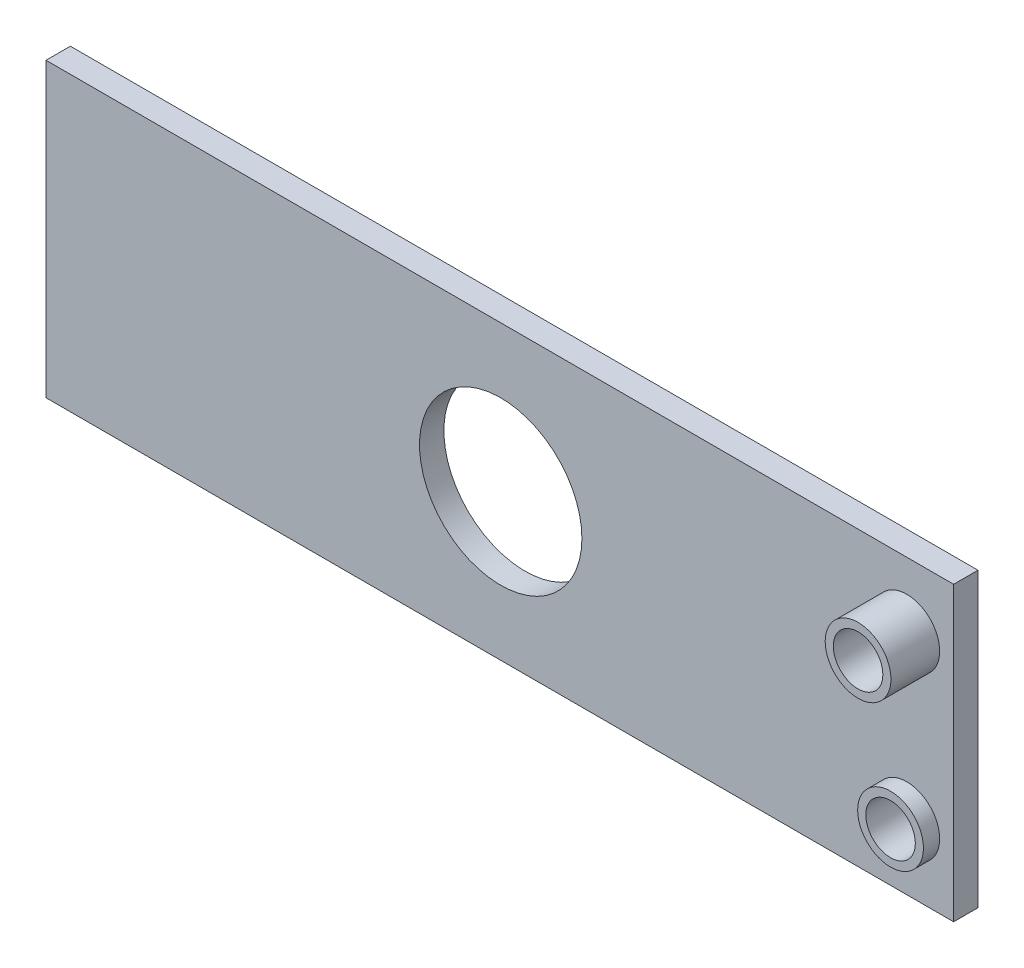
ISO-10303-21;
HEADER;
FILE_DESCRIPTION(('STEP AP214'),'2;1');
FILE_NAME('part.step','',(''),(''),'','','');
FILE_SCHEMA(('AUTOMOTIVE_DESIGN { 1 0 10303 214 1 1 1 1 }'));
ENDSEC;
DATA;
#1=APPLICATION_CONTEXT('core data for automotive mechanical design processes');
#2=APPLICATION_PROTOCOL_DEFINITION('international standard','automotive_design',2000,#1);
#3=PRODUCT_CONTEXT('',#1,'mechanical');
#4=PRODUCT('Part','Part','',(#3));
#5=PRODUCT_RELATED_PRODUCT_CATEGORY('part','',(#4));
#6=PRODUCT_DEFINITION_FORMATION('','',#4);
#7=PRODUCT_DEFINITION_CONTEXT('part definition',#1,'design');
#8=PRODUCT_DEFINITION('design','',#6,#7);
#9=PRODUCT_DEFINITION_SHAPE('','',#8);
#10=(LENGTH_UNIT() NAMED_UNIT(*) SI_UNIT(.MILLI.,.METRE.));
#11=(NAMED_UNIT(*) PLANE_ANGLE_UNIT() SI_UNIT($,.RADIAN.));
#12=(NAMED_UNIT(*) SI_UNIT($,.STERADIAN.) SOLID_ANGLE_UNIT());
#13=UNCERTAINTY_MEASURE_WITH_UNIT(LENGTH_MEASURE(1.E-05),#10,'distance_accuracy_value','');
#14=(GEOMETRIC_REPRESENTATION_CONTEXT(3) GLOBAL_UNCERTAINTY_ASSIGNED_CONTEXT((#13)) GLOBAL_UNIT_ASSIGNED_CONTEXT((#10,
#11,#12)) REPRESENTATION_CONTEXT('',''));
#15=CARTESIAN_POINT('',(0.,0.,0.));
#16=DIRECTION('',(0.,0.,1.));
#17=DIRECTION('',(1.,0.,0.));
#18=AXIS2_PLACEMENT_3D('',#15,#16,#17);
#19=CARTESIAN_POINT('',(0.,0.,3.));
#20=DIRECTION('',(0.,0.,-1.));
#21=DIRECTION('',(-1.,0.,0.));
#22=AXIS2_PLACEMENT_3D('',#19,#20,#21);
#23=PLANE('',#22);
#24=CARTESIAN_POINT('',(96.0099990002,-10.,3.));
#25=DIRECTION('',(0.,0.,-1.));
#26=DIRECTION('',(-1.,0.,0.));
#27=AXIS2_PLACEMENT_3D('',#24,#25,#26);
#28=CIRCLE('',#27,4.04999999999999);
#29=CARTESIAN_POINT('',(91.9599990002,-10.,3.));
#30=VERTEX_POINT('',#29);
#31=EDGE_CURVE('E49',#30,#30,#28,.F.);
#32=ORIENTED_EDGE('',*,*,#31,.F.);
#33=EDGE_LOOP('',(#32));
#34=FACE_BOUND('',#33,.T.);
#35=CARTESIAN_POINT('',(46.,0.,3.));
#36=DIRECTION('',(0.,0.,1.));
#37=DIRECTION('',(1.,0.,0.));
#38=AXIS2_PLACEMENT_3D('',#35,#36,#37);
#39=CIRCLE('',#38,10.);
#40=CARTESIAN_POINT('',(56.,0.,3.));
#41=VERTEX_POINT('',#40);
#42=EDGE_CURVE('E139',#41,#41,#39,.T.);
#43=ORIENTED_EDGE('',*,*,#42,.F.);
#44=EDGE_LOOP('',(#43));
#45=FACE_BOUND('',#44,.T.);
#46=DIRECTION('',(1.,0.,0.));
#47=VECTOR('',#46,1.);
#48=CARTESIAN_POINT('',(-9.99999999999999,-18.,3.));
#49=LINE('',#48,#47);
#50=CARTESIAN_POINT('',(-9.99999999999999,-18.,3.));
#51=VERTEX_POINT('',#50);
#52=CARTESIAN_POINT('',(101.78,-18.,3.));
#53=VERTEX_POINT('',#52);
#54=EDGE_CURVE('E81',#51,#53,#49,.T.);
#55=ORIENTED_EDGE('',*,*,#54,.T.);
#56=DIRECTION('',(0.,-1.,0.));
#57=VECTOR('',#56,1.);
#58=CARTESIAN_POINT('',(101.78,18.,3.));
#59=LINE('',#58,#57);
#60=CARTESIAN_POINT('',(101.78,18.,3.));
#61=VERTEX_POINT('',#60);
#62=EDGE_CURVE('E89',#61,#53,#59,.T.);
#63=ORIENTED_EDGE('',*,*,#62,.F.);
#64=DIRECTION('',(1.,0.,0.));
#65=VECTOR('',#64,1.);
#66=CARTESIAN_POINT('',(-9.99999999999999,18.,3.));
#67=LINE('',#66,#65);
#68=CARTESIAN_POINT('',(-9.99999999999999,18.,3.));
#69=VERTEX_POINT('',#68);
#70=EDGE_CURVE('E100',#69,#61,#67,.T.);
#71=ORIENTED_EDGE('',*,*,#70,.F.);
#72=DIRECTION('',(0.,-1.,0.));
#73=VECTOR('',#72,1.);
#74=CARTESIAN_POINT('',(-9.99999999999999,18.,3.));
#75=LINE('',#74,#73);
#76=EDGE_CURVE('E57',#69,#51,#75,.T.);
#77=ORIENTED_EDGE('',*,*,#76,.T.);
#78=EDGE_LOOP('',(#55,#63,#71,#77));
#79=FACE_BOUND('',#78,.T.);
#80=CARTESIAN_POINT('',(96.0099990002,10.,3.));
#81=DIRECTION('',(0.,0.,-1.));
#82=DIRECTION('',(-1.,0.,0.));
#83=AXIS2_PLACEMENT_3D('',#80,#81,#82);
#84=CIRCLE('',#83,4.05);
#85=CARTESIAN_POINT('',(91.9599990002,10.,3.));
#86=VERTEX_POINT('',#85);
#87=EDGE_CURVE('E11',#86,#86,#84,.F.);
#88=ORIENTED_EDGE('',*,*,#87,.F.);
#89=EDGE_LOOP('',(#88));
#90=FACE_BOUND('',#89,.T.);
#91=ADVANCED_FACE('F39',(#34,#45,#79,#90),#23,.F.);
#92=CARTESIAN_POINT('',(-9.99999999999999,-18.,3.));
#93=DIRECTION('',(0.,1.,0.));
#94=DIRECTION('',(0.,0.,1.));
#95=AXIS2_PLACEMENT_3D('',#92,#93,#94);
#96=PLANE('',#95);
#97=DIRECTION('',(1.,0.,0.));
#98=VECTOR('',#97,1.);
#99=CARTESIAN_POINT('',(-9.99999999999999,-18.,0.));
#100=LINE('',#99,#98);
#101=CARTESIAN_POINT('',(-9.99999999999999,-18.,0.));
#102=VERTEX_POINT('',#101);
#103=CARTESIAN_POINT('',(101.78,-18.,0.));
#104=VERTEX_POINT('',#103);
#105=EDGE_CURVE('E111',#102,#104,#100,.T.);
#106=ORIENTED_EDGE('',*,*,#105,.T.);
#107=DIRECTION('',(0.,0.,-1.));
#108=VECTOR('',#107,1.);
#109=CARTESIAN_POINT('',(101.78,-18.,3.));
#110=LINE('',#109,#108);
#111=EDGE_CURVE('E97',#53,#104,#110,.T.);
#112=ORIENTED_EDGE('',*,*,#111,.F.);
#113=ORIENTED_EDGE('',*,*,#54,.F.);
#114=DIRECTION('',(0.,0.,-1.));
#115=VECTOR('',#114,1.);
#116=CARTESIAN_POINT('',(-9.99999999999999,-18.,3.));
#117=LINE('',#116,#115);
#118=EDGE_CURVE('E107',#51,#102,#117,.T.);
#119=ORIENTED_EDGE('',*,*,#118,.T.);
#120=EDGE_LOOP('',(#106,#112,#113,#119));
#121=FACE_BOUND('',#120,.T.);
#122=ADVANCED_FACE('F41',(#121),#96,.F.);
#123=CARTESIAN_POINT('',(101.78,18.,3.));
#124=DIRECTION('',(1.,0.,0.));
#125=DIRECTION('',(0.,0.,-1.));
#126=AXIS2_PLACEMENT_3D('',#123,#124,#125);
#127=PLANE('',#126);
#128=DIRECTION('',(0.,-1.,0.));
#129=VECTOR('',#128,1.);
#130=CARTESIAN_POINT('',(101.78,18.,0.));
#131=LINE('',#130,#129);
#132=CARTESIAN_POINT('',(101.78,18.,0.));
#133=VERTEX_POINT('',#132);
#134=EDGE_CURVE('E91',#133,#104,#131,.T.);
#135=ORIENTED_EDGE('',*,*,#134,.F.);
#136=DIRECTION('',(0.,0.,-1.));
#137=VECTOR('',#136,1.);
#138=CARTESIAN_POINT('',(101.78,18.,3.));
#139=LINE('',#138,#137);
#140=EDGE_CURVE('E87',#61,#133,#139,.T.);
#141=ORIENTED_EDGE('',*,*,#140,.F.);
#142=ORIENTED_EDGE('',*,*,#62,.T.);
#143=ORIENTED_EDGE('',*,*,#111,.T.);
#144=EDGE_LOOP('',(#135,#141,#142,#143));
#145=FACE_BOUND('',#144,.T.);
#146=ADVANCED_FACE('F88',(#145),#127,.T.);
#147=CARTESIAN_POINT('',(-9.99999999999999,18.,3.));
#148=DIRECTION('',(0.,1.,0.));
#149=DIRECTION('',(0.,0.,1.));
#150=AXIS2_PLACEMENT_3D('',#147,#148,#149);
#151=PLANE('',#150);
#152=DIRECTION('',(1.,0.,0.));
#153=VECTOR('',#152,1.);
#154=CARTESIAN_POINT('',(-9.99999999999999,18.,0.));
#155=LINE('',#154,#153);
#156=CARTESIAN_POINT('',(-9.99999999999999,18.,0.));
#157=VERTEX_POINT('',#156);
#158=EDGE_CURVE('E118',#157,#133,#155,.T.);
#159=ORIENTED_EDGE('',*,*,#158,.F.);
#160=DIRECTION('',(0.,0.,-1.));
#161=VECTOR('',#160,1.);
#162=CARTESIAN_POINT('',(-9.99999999999999,18.,3.));
#163=LINE('',#162,#161);
#164=EDGE_CURVE('E73',#69,#157,#163,.T.);
#165=ORIENTED_EDGE('',*,*,#164,.F.);
#166=ORIENTED_EDGE('',*,*,#70,.T.);
#167=ORIENTED_EDGE('',*,*,#140,.T.);
#168=EDGE_LOOP('',(#159,#165,#166,#167));
#169=FACE_BOUND('',#168,.T.);
#170=ADVANCED_FACE('F103',(#169),#151,.T.);
#171=CARTESIAN_POINT('',(-9.99999999999999,18.,3.));
#172=DIRECTION('',(1.,0.,0.));
#173=DIRECTION('',(0.,0.,-1.));
#174=AXIS2_PLACEMENT_3D('',#171,#172,#173);
#175=PLANE('',#174);
#176=DIRECTION('',(0.,-1.,0.));
#177=VECTOR('',#176,1.);
#178=CARTESIAN_POINT('',(-9.99999999999999,18.,0.));
#179=LINE('',#178,#177);
#180=EDGE_CURVE('E76',#157,#102,#179,.T.);
#181=ORIENTED_EDGE('',*,*,#180,.T.);
#182=ORIENTED_EDGE('',*,*,#118,.F.);
#183=ORIENTED_EDGE('',*,*,#76,.F.);
#184=ORIENTED_EDGE('',*,*,#164,.T.);
#185=EDGE_LOOP('',(#181,#182,#183,#184));
#186=FACE_BOUND('',#185,.T.);
#187=ADVANCED_FACE('F209',(#186),#175,.F.);
#188=CARTESIAN_POINT('',(0.,0.,0.));
#189=DIRECTION('',(0.,0.,-1.));
#190=DIRECTION('',(-1.,0.,0.));
#191=AXIS2_PLACEMENT_3D('',#188,#189,#190);
#192=PLANE('',#191);
#193=CARTESIAN_POINT('',(46.,0.,0.));
#194=DIRECTION('',(0.,0.,1.));
#195=DIRECTION('',(1.,0.,0.));
#196=AXIS2_PLACEMENT_3D('',#193,#194,#195);
#197=CIRCLE('',#196,10.);
#198=CARTESIAN_POINT('',(56.,0.,0.));
#199=VERTEX_POINT('',#198);
#200=EDGE_CURVE('E142',#199,#199,#197,.T.);
#201=ORIENTED_EDGE('',*,*,#200,.T.);
#202=EDGE_LOOP('',(#201));
#203=FACE_BOUND('',#202,.T.);
#204=CARTESIAN_POINT('',(96.0099990002,10.,0.));
#205=DIRECTION('',(0.,0.,1.));
#206=DIRECTION('',(1.,0.,0.));
#207=AXIS2_PLACEMENT_3D('',#204,#205,#206);
#208=CIRCLE('',#207,3.04999999999999);
#209=CARTESIAN_POINT('',(99.0599990002,10.,0.));
#210=VERTEX_POINT('',#209);
#211=EDGE_CURVE('E148',#210,#210,#208,.T.);
#212=ORIENTED_EDGE('',*,*,#211,.T.);
#213=EDGE_LOOP('',(#212));
#214=FACE_BOUND('',#213,.T.);
#215=CARTESIAN_POINT('',(96.0099990002,-10.,0.));
#216=DIRECTION('',(0.,0.,1.));
#217=DIRECTION('',(1.,0.,0.));
#218=AXIS2_PLACEMENT_3D('',#215,#216,#217);
#219=CIRCLE('',#218,3.04999999999999);
#220=CARTESIAN_POINT('',(99.0599990002,-10.,0.));
#221=VERTEX_POINT('',#220);
#222=EDGE_CURVE('E115',#221,#221,#219,.T.);
#223=ORIENTED_EDGE('',*,*,#222,.T.);
#224=EDGE_LOOP('',(#223));
#225=FACE_BOUND('',#224,.T.);
#226=ORIENTED_EDGE('',*,*,#105,.F.);
#227=ORIENTED_EDGE('',*,*,#180,.F.);
#228=ORIENTED_EDGE('',*,*,#158,.T.);
#229=ORIENTED_EDGE('',*,*,#134,.T.);
#230=EDGE_LOOP('',(#226,#227,#228,#229));
#231=FACE_BOUND('',#230,.T.);
#232=ADVANCED_FACE('F204',(#203,#214,#225,#231),#192,.T.);
#233=CARTESIAN_POINT('',(96.0099990002,-10.,0.));
#234=DIRECTION('',(0.,0.,1.));
#235=DIRECTION('',(1.,0.,0.));
#236=AXIS2_PLACEMENT_3D('',#233,#234,#235);
#237=CYLINDRICAL_SURFACE('',#236,3.04999999999999);
#238=ORIENTED_EDGE('',*,*,#222,.F.);
#239=EDGE_LOOP('',(#238));
#240=FACE_BOUND('',#239,.T.);
#241=CARTESIAN_POINT('',(96.0099990002,-10.,5.));
#242=DIRECTION('',(0.,0.,1.));
#243=DIRECTION('',(1.,0.,0.));
#244=AXIS2_PLACEMENT_3D('',#241,#242,#243);
#245=CIRCLE('',#244,3.04999999999999);
#246=CARTESIAN_POINT('',(99.0599990002,-10.,5.));
#247=VERTEX_POINT('',#246);
#248=EDGE_CURVE('E151',#247,#247,#245,.T.);
#249=ORIENTED_EDGE('',*,*,#248,.T.);
#250=EDGE_LOOP('',(#249));
#251=FACE_BOUND('',#250,.T.);
#252=ADVANCED_FACE('F198',(#240,#251),#237,.F.);
#253=CARTESIAN_POINT('',(96.0099990002,10.,0.));
#254=DIRECTION('',(0.,0.,1.));
#255=DIRECTION('',(1.,0.,0.));
#256=AXIS2_PLACEMENT_3D('',#253,#254,#255);
#257=CYLINDRICAL_SURFACE('',#256,3.04999999999999);
#258=ORIENTED_EDGE('',*,*,#211,.F.);
#259=EDGE_LOOP('',(#258));
#260=FACE_BOUND('',#259,.T.);
#261=CARTESIAN_POINT('',(96.0099990002,10.,9.));
#262=DIRECTION('',(0.,0.,1.));
#263=DIRECTION('',(1.,0.,0.));
#264=AXIS2_PLACEMENT_3D('',#261,#262,#263);
#265=CIRCLE('',#264,3.04999999999999);
#266=CARTESIAN_POINT('',(99.0599990002,10.,9.));
#267=VERTEX_POINT('',#266);
#268=EDGE_CURVE('E170',#267,#267,#265,.T.);
#269=ORIENTED_EDGE('',*,*,#268,.T.);
#270=EDGE_LOOP('',(#269));
#271=FACE_BOUND('',#270,.T.);
#272=ADVANCED_FACE('F175',(#260,#271),#257,.F.);
#273=CARTESIAN_POINT('',(46.,0.,0.));
#274=DIRECTION('',(0.,0.,1.));
#275=DIRECTION('',(1.,0.,0.));
#276=AXIS2_PLACEMENT_3D('',#273,#274,#275);
#277=CYLINDRICAL_SURFACE('',#276,10.);
#278=ORIENTED_EDGE('',*,*,#200,.F.);
#279=EDGE_LOOP('',(#278));
#280=FACE_BOUND('',#279,.T.);
#281=ORIENTED_EDGE('',*,*,#42,.T.);
#282=EDGE_LOOP('',(#281));
#283=FACE_BOUND('',#282,.T.);
#284=ADVANCED_FACE('F193',(#280,#283),#277,.F.);
#285=CARTESIAN_POINT('',(96.0099990002,-10.,5.));
#286=DIRECTION('',(0.,0.,1.));
#287=DIRECTION('',(1.,0.,0.));
#288=AXIS2_PLACEMENT_3D('',#285,#286,#287);
#289=PLANE('',#288);
#290=CARTESIAN_POINT('',(96.0099990002,-10.,5.));
#291=DIRECTION('',(0.,0.,1.));
#292=DIRECTION('',(1.,0.,0.));
#293=AXIS2_PLACEMENT_3D('',#290,#291,#292);
#294=CIRCLE('',#293,4.04999999999999);
#295=CARTESIAN_POINT('',(100.0599990002,-10.,5.));
#296=VERTEX_POINT('',#295);
#297=EDGE_CURVE('E143',#296,#296,#294,.T.);
#298=ORIENTED_EDGE('',*,*,#297,.T.);
#299=EDGE_LOOP('',(#298));
#300=FACE_BOUND('',#299,.T.);
#301=ORIENTED_EDGE('',*,*,#248,.F.);
#302=EDGE_LOOP('',(#301));
#303=FACE_BOUND('',#302,.T.);
#304=ADVANCED_FACE('F188',(#300,#303),#289,.T.);
#305=CARTESIAN_POINT('',(96.0099990002,-10.,5.));
#306=DIRECTION('',(0.,0.,-1.));
#307=DIRECTION('',(-1.,0.,0.));
#308=AXIS2_PLACEMENT_3D('',#305,#306,#307);
#309=CYLINDRICAL_SURFACE('',#308,4.04999999999999);
#310=ORIENTED_EDGE('',*,*,#297,.F.);
#311=EDGE_LOOP('',(#310));
#312=FACE_BOUND('',#311,.T.);
#313=ORIENTED_EDGE('',*,*,#31,.T.);
#314=EDGE_LOOP('',(#313));
#315=FACE_BOUND('',#314,.T.);
#316=ADVANCED_FACE('F132',(#312,#315),#309,.T.);
#317=CARTESIAN_POINT('',(96.0099990002,10.,9.));
#318=DIRECTION('',(0.,0.,1.));
#319=DIRECTION('',(1.,0.,0.));
#320=AXIS2_PLACEMENT_3D('',#317,#318,#319);
#321=PLANE('',#320);
#322=CARTESIAN_POINT('',(96.0099990002,10.,9.));
#323=DIRECTION('',(0.,0.,1.));
#324=DIRECTION('',(1.,0.,0.));
#325=AXIS2_PLACEMENT_3D('',#322,#323,#324);
#326=CIRCLE('',#325,4.05);
#327=CARTESIAN_POINT('',(100.0599990002,10.,9.));
#328=VERTEX_POINT('',#327);
#329=EDGE_CURVE('E166',#328,#328,#326,.T.);
#330=ORIENTED_EDGE('',*,*,#329,.T.);
#331=EDGE_LOOP('',(#330));
#332=FACE_BOUND('',#331,.T.);
#333=ORIENTED_EDGE('',*,*,#268,.F.);
#334=EDGE_LOOP('',(#333));
#335=FACE_BOUND('',#334,.T.);
#336=ADVANCED_FACE('F177',(#332,#335),#321,.T.);
#337=CARTESIAN_POINT('',(96.0099990002,10.,9.));
#338=DIRECTION('',(0.,0.,-1.));
#339=DIRECTION('',(-1.,0.,0.));
#340=AXIS2_PLACEMENT_3D('',#337,#338,#339);
#341=CYLINDRICAL_SURFACE('',#340,4.05);
#342=ORIENTED_EDGE('',*,*,#329,.F.);
#343=EDGE_LOOP('',(#342));
#344=FACE_BOUND('',#343,.T.);
#345=ORIENTED_EDGE('',*,*,#87,.T.);
#346=EDGE_LOOP('',(#345));
#347=FACE_BOUND('',#346,.T.);
#348=ADVANCED_FACE('F179',(#344,#347),#341,.T.);
#349=CLOSED_SHELL('',(#91,#122,#146,#170,#187,#232,#252,#272,#284,#304,#316,#336,#348));
#350=MANIFOLD_SOLID_BREP('B2',#349);
#351=ADVANCED_BREP_SHAPE_REPRESENTATION('',(#18,#350),#14);
#352=SHAPE_DEFINITION_REPRESENTATION(#9,#351);
ENDSEC;
END-ISO-10303-21;
